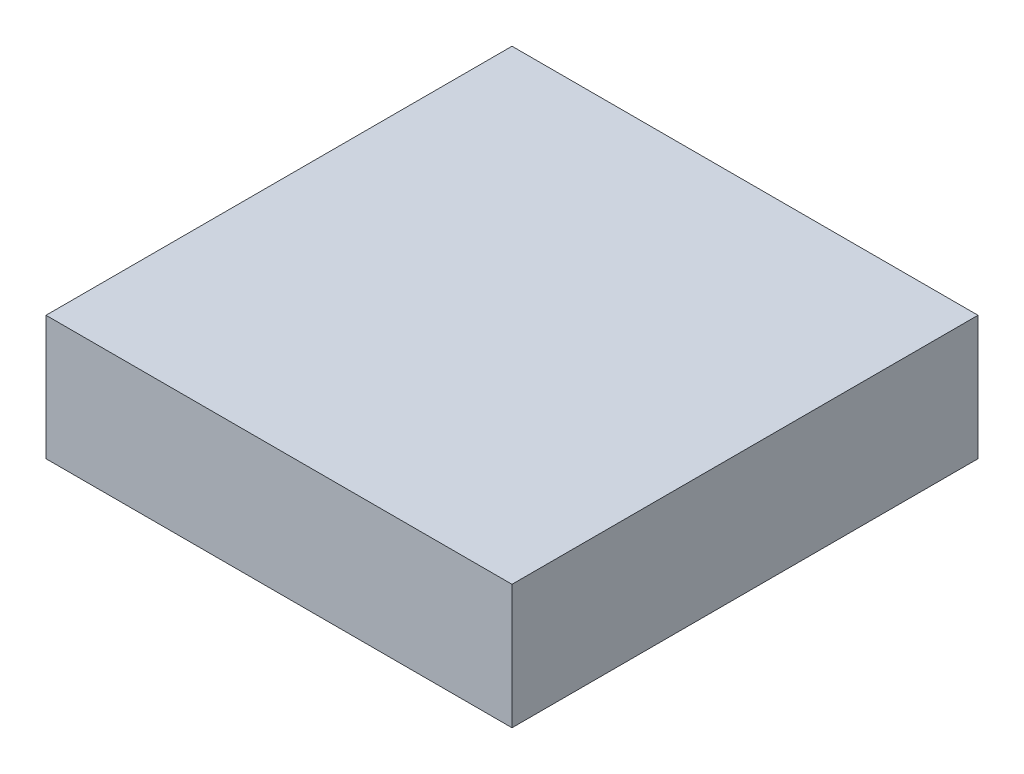
ISO-10303-21;
HEADER;
FILE_DESCRIPTION(('STEP AP214'),'2;1');
FILE_NAME('part.step','',(''),(''),'','','');
FILE_SCHEMA(('AUTOMOTIVE_DESIGN { 1 0 10303 214 1 1 1 1 }'));
ENDSEC;
DATA;
#1=APPLICATION_CONTEXT('core data for automotive mechanical design processes');
#2=APPLICATION_PROTOCOL_DEFINITION('international standard','automotive_design',2000,#1);
#3=PRODUCT_CONTEXT('',#1,'mechanical');
#4=PRODUCT('Part','Part','',(#3));
#5=PRODUCT_RELATED_PRODUCT_CATEGORY('part','',(#4));
#6=PRODUCT_DEFINITION_FORMATION('','',#4);
#7=PRODUCT_DEFINITION_CONTEXT('part definition',#1,'design');
#8=PRODUCT_DEFINITION('design','',#6,#7);
#9=PRODUCT_DEFINITION_SHAPE('','',#8);
#10=(LENGTH_UNIT() NAMED_UNIT(*) SI_UNIT(.MILLI.,.METRE.));
#11=(NAMED_UNIT(*) PLANE_ANGLE_UNIT() SI_UNIT($,.RADIAN.));
#12=(NAMED_UNIT(*) SI_UNIT($,.STERADIAN.) SOLID_ANGLE_UNIT());
#13=UNCERTAINTY_MEASURE_WITH_UNIT(LENGTH_MEASURE(1.E-05),#10,'distance_accuracy_value','');
#14=(GEOMETRIC_REPRESENTATION_CONTEXT(3) GLOBAL_UNCERTAINTY_ASSIGNED_CONTEXT((#13)) GLOBAL_UNIT_ASSIGNED_CONTEXT((#10,
#11,#12)) REPRESENTATION_CONTEXT('',''));
#15=CARTESIAN_POINT('',(0.,0.,0.));
#16=DIRECTION('',(0.,0.,1.));
#17=DIRECTION('',(1.,0.,0.));
#18=AXIS2_PLACEMENT_3D('',#15,#16,#17);
#19=CARTESIAN_POINT('',(15.,8.,15.));
#20=DIRECTION('',(-1.,0.,0.));
#21=DIRECTION('',(0.,0.,1.));
#22=AXIS2_PLACEMENT_3D('',#19,#20,#21);
#23=PLANE('',#22);
#24=DIRECTION('',(0.,0.,-1.));
#25=VECTOR('',#24,1.);
#26=CARTESIAN_POINT('',(15.,0.,15.));
#27=LINE('',#26,#25);
#28=CARTESIAN_POINT('',(15.,0.,15.));
#29=VERTEX_POINT('',#28);
#30=CARTESIAN_POINT('',(15.,0.,-15.));
#31=VERTEX_POINT('',#30);
#32=EDGE_CURVE('E96',#29,#31,#27,.T.);
#33=ORIENTED_EDGE('',*,*,#32,.T.);
#34=DIRECTION('',(0.,-1.,0.));
#35=VECTOR('',#34,1.);
#36=CARTESIAN_POINT('',(15.,8.,-15.));
#37=LINE('',#36,#35);
#38=CARTESIAN_POINT('',(15.,8.,-15.));
#39=VERTEX_POINT('',#38);
#40=EDGE_CURVE('E11',#39,#31,#37,.T.);
#41=ORIENTED_EDGE('',*,*,#40,.F.);
#42=DIRECTION('',(0.,0.,-1.));
#43=VECTOR('',#42,1.);
#44=CARTESIAN_POINT('',(15.,8.,15.));
#45=LINE('',#44,#43);
#46=CARTESIAN_POINT('',(15.,8.,15.));
#47=VERTEX_POINT('',#46);
#48=EDGE_CURVE('E84',#47,#39,#45,.T.);
#49=ORIENTED_EDGE('',*,*,#48,.F.);
#50=DIRECTION('',(0.,-1.,0.));
#51=VECTOR('',#50,1.);
#52=CARTESIAN_POINT('',(15.,8.,15.));
#53=LINE('',#52,#51);
#54=EDGE_CURVE('E92',#47,#29,#53,.T.);
#55=ORIENTED_EDGE('',*,*,#54,.T.);
#56=EDGE_LOOP('',(#33,#41,#49,#55));
#57=FACE_BOUND('',#56,.T.);
#58=ADVANCED_FACE('F33',(#57),#23,.F.);
#59=CARTESIAN_POINT('',(-15.,8.,-15.));
#60=DIRECTION('',(0.,0.,1.));
#61=DIRECTION('',(1.,0.,0.));
#62=AXIS2_PLACEMENT_3D('',#59,#60,#61);
#63=PLANE('',#62);
#64=DIRECTION('',(-1.,0.,0.));
#65=VECTOR('',#64,1.);
#66=CARTESIAN_POINT('',(-15.,0.,-15.));
#67=LINE('',#66,#65);
#68=CARTESIAN_POINT('',(-15.,0.,-15.));
#69=VERTEX_POINT('',#68);
#70=EDGE_CURVE('E88',#31,#69,#67,.T.);
#71=ORIENTED_EDGE('',*,*,#70,.T.);
#72=DIRECTION('',(0.,-1.,0.));
#73=VECTOR('',#72,1.);
#74=CARTESIAN_POINT('',(-15.,8.,-15.));
#75=LINE('',#74,#73);
#76=CARTESIAN_POINT('',(-15.,8.,-15.));
#77=VERTEX_POINT('',#76);
#78=EDGE_CURVE('E41',#77,#69,#75,.T.);
#79=ORIENTED_EDGE('',*,*,#78,.F.);
#80=DIRECTION('',(-1.,0.,0.));
#81=VECTOR('',#80,1.);
#82=CARTESIAN_POINT('',(-15.,8.,-15.));
#83=LINE('',#82,#81);
#84=EDGE_CURVE('E79',#39,#77,#83,.T.);
#85=ORIENTED_EDGE('',*,*,#84,.F.);
#86=ORIENTED_EDGE('',*,*,#40,.T.);
#87=EDGE_LOOP('',(#71,#79,#85,#86));
#88=FACE_BOUND('',#87,.T.);
#89=ADVANCED_FACE('F87',(#88),#63,.F.);
#90=CARTESIAN_POINT('',(-15.,8.,15.));
#91=DIRECTION('',(1.,0.,0.));
#92=DIRECTION('',(0.,0.,-1.));
#93=AXIS2_PLACEMENT_3D('',#90,#91,#92);
#94=PLANE('',#93);
#95=DIRECTION('',(0.,0.,1.));
#96=VECTOR('',#95,1.);
#97=CARTESIAN_POINT('',(-15.,0.,15.));
#98=LINE('',#97,#96);
#99=CARTESIAN_POINT('',(-15.,0.,15.));
#100=VERTEX_POINT('',#99);
#101=EDGE_CURVE('E66',#69,#100,#98,.T.);
#102=ORIENTED_EDGE('',*,*,#101,.T.);
#103=DIRECTION('',(0.,-1.,0.));
#104=VECTOR('',#103,1.);
#105=CARTESIAN_POINT('',(-15.,8.,15.));
#106=LINE('',#105,#104);
#107=CARTESIAN_POINT('',(-15.,8.,15.));
#108=VERTEX_POINT('',#107);
#109=EDGE_CURVE('E89',#108,#100,#106,.T.);
#110=ORIENTED_EDGE('',*,*,#109,.F.);
#111=DIRECTION('',(0.,0.,1.));
#112=VECTOR('',#111,1.);
#113=CARTESIAN_POINT('',(-15.,8.,15.));
#114=LINE('',#113,#112);
#115=EDGE_CURVE('E82',#77,#108,#114,.T.);
#116=ORIENTED_EDGE('',*,*,#115,.F.);
#117=ORIENTED_EDGE('',*,*,#78,.T.);
#118=EDGE_LOOP('',(#102,#110,#116,#117));
#119=FACE_BOUND('',#118,.T.);
#120=ADVANCED_FACE('F90',(#119),#94,.F.);
#121=CARTESIAN_POINT('',(-15.,8.,15.));
#122=DIRECTION('',(0.,0.,-1.));
#123=DIRECTION('',(-1.,0.,0.));
#124=AXIS2_PLACEMENT_3D('',#121,#122,#123);
#125=PLANE('',#124);
#126=DIRECTION('',(1.,0.,0.));
#127=VECTOR('',#126,1.);
#128=CARTESIAN_POINT('',(-15.,0.,15.));
#129=LINE('',#128,#127);
#130=EDGE_CURVE('E72',#100,#29,#129,.T.);
#131=ORIENTED_EDGE('',*,*,#130,.T.);
#132=ORIENTED_EDGE('',*,*,#54,.F.);
#133=DIRECTION('',(1.,0.,0.));
#134=VECTOR('',#133,1.);
#135=CARTESIAN_POINT('',(-15.,8.,15.));
#136=LINE('',#135,#134);
#137=EDGE_CURVE('E49',#108,#47,#136,.T.);
#138=ORIENTED_EDGE('',*,*,#137,.F.);
#139=ORIENTED_EDGE('',*,*,#109,.T.);
#140=EDGE_LOOP('',(#131,#132,#138,#139));
#141=FACE_BOUND('',#140,.T.);
#142=ADVANCED_FACE('F103',(#141),#125,.F.);
#143=CARTESIAN_POINT('',(0.,8.,0.));
#144=DIRECTION('',(0.,-1.,0.));
#145=DIRECTION('',(0.,0.,-1.));
#146=AXIS2_PLACEMENT_3D('',#143,#144,#145);
#147=PLANE('',#146);
#148=ORIENTED_EDGE('',*,*,#48,.T.);
#149=ORIENTED_EDGE('',*,*,#84,.T.);
#150=ORIENTED_EDGE('',*,*,#115,.T.);
#151=ORIENTED_EDGE('',*,*,#137,.T.);
#152=EDGE_LOOP('',(#148,#149,#150,#151));
#153=FACE_BOUND('',#152,.T.);
#154=ADVANCED_FACE('F80',(#153),#147,.F.);
#155=CARTESIAN_POINT('',(0.,0.,0.));
#156=DIRECTION('',(0.,-1.,0.));
#157=DIRECTION('',(0.,0.,-1.));
#158=AXIS2_PLACEMENT_3D('',#155,#156,#157);
#159=PLANE('',#158);
#160=ORIENTED_EDGE('',*,*,#32,.F.);
#161=ORIENTED_EDGE('',*,*,#130,.F.);
#162=ORIENTED_EDGE('',*,*,#101,.F.);
#163=ORIENTED_EDGE('',*,*,#70,.F.);
#164=EDGE_LOOP('',(#160,#161,#162,#163));
#165=FACE_BOUND('',#164,.T.);
#166=ADVANCED_FACE('F106',(#165),#159,.T.);
#167=CLOSED_SHELL('',(#58,#89,#120,#142,#154,#166));
#168=MANIFOLD_SOLID_BREP('B2',#167);
#169=ADVANCED_BREP_SHAPE_REPRESENTATION('',(#18,#168),#14);
#170=SHAPE_DEFINITION_REPRESENTATION(#9,#169);
ENDSEC;
END-ISO-10303-21;
